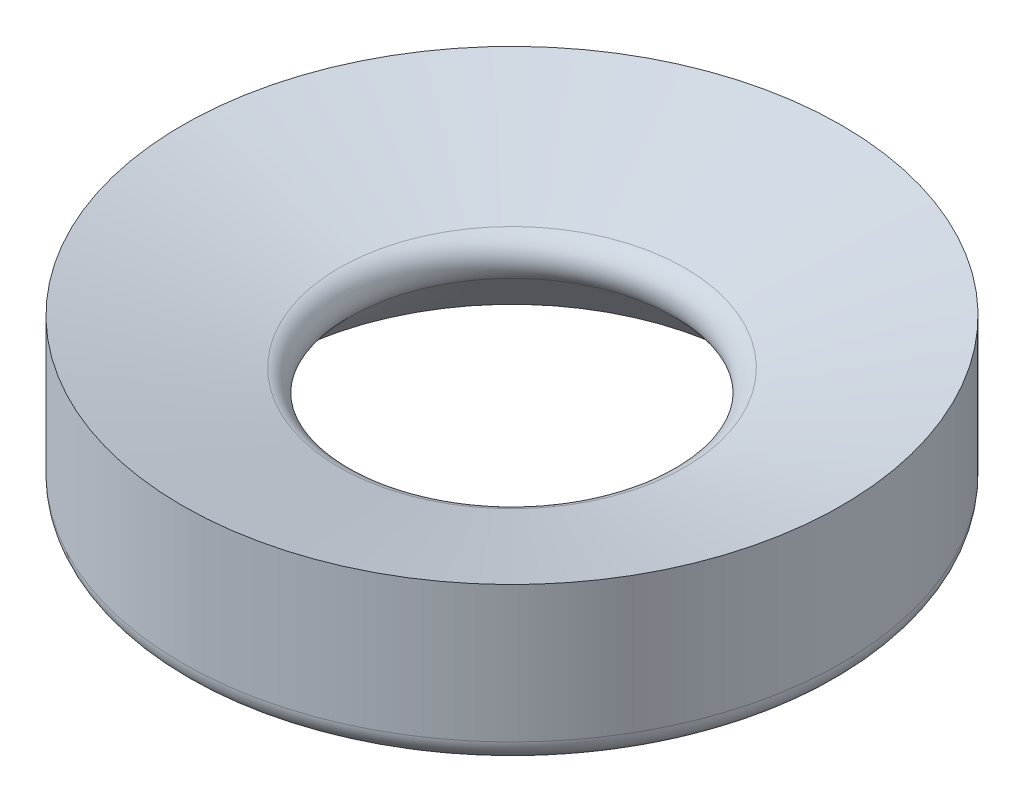
ISO-10303-21;
HEADER;
FILE_DESCRIPTION(('STEP AP214'),'2;1');
FILE_NAME('part.step','',(''),(''),'','','');
FILE_SCHEMA(('AUTOMOTIVE_DESIGN { 1 0 10303 214 1 1 1 1 }'));
ENDSEC;
DATA;
#1=APPLICATION_CONTEXT('core data for automotive mechanical design processes');
#2=APPLICATION_PROTOCOL_DEFINITION('international standard','automotive_design',2000,#1);
#3=PRODUCT_CONTEXT('',#1,'mechanical');
#4=PRODUCT('Part','Part','',(#3));
#5=PRODUCT_RELATED_PRODUCT_CATEGORY('part','',(#4));
#6=PRODUCT_DEFINITION_FORMATION('','',#4);
#7=PRODUCT_DEFINITION_CONTEXT('part definition',#1,'design');
#8=PRODUCT_DEFINITION('design','',#6,#7);
#9=PRODUCT_DEFINITION_SHAPE('','',#8);
#10=(LENGTH_UNIT() NAMED_UNIT(*) SI_UNIT(.MILLI.,.METRE.));
#11=(NAMED_UNIT(*) PLANE_ANGLE_UNIT() SI_UNIT($,.RADIAN.));
#12=(NAMED_UNIT(*) SI_UNIT($,.STERADIAN.) SOLID_ANGLE_UNIT());
#13=UNCERTAINTY_MEASURE_WITH_UNIT(LENGTH_MEASURE(1.E-05),#10,'distance_accuracy_value','');
#14=(GEOMETRIC_REPRESENTATION_CONTEXT(3) GLOBAL_UNCERTAINTY_ASSIGNED_CONTEXT((#13)) GLOBAL_UNIT_ASSIGNED_CONTEXT((#10,
#11,#12)) REPRESENTATION_CONTEXT('',''));
#15=CARTESIAN_POINT('',(0.,0.,0.));
#16=DIRECTION('',(0.,0.,1.));
#17=DIRECTION('',(1.,0.,0.));
#18=AXIS2_PLACEMENT_3D('',#15,#16,#17);
#19=CARTESIAN_POINT('',(0.,17.78,0.));
#20=DIRECTION('',(0.,-1.,0.));
#21=DIRECTION('',(0.,0.,-1.));
#22=AXIS2_PLACEMENT_3D('',#19,#20,#21);
#23=CYLINDRICAL_SURFACE('',#22,36.83);
#24=CARTESIAN_POINT('',(0.,2.54,0.));
#25=DIRECTION('',(0.,1.,0.));
#26=DIRECTION('',(0.,0.,1.));
#27=AXIS2_PLACEMENT_3D('',#24,#25,#26);
#28=CIRCLE('',#27,36.83);
#29=CARTESIAN_POINT('',(0.,2.54,-36.83));
#30=VERTEX_POINT('',#29);
#31=EDGE_CURVE('E50',#30,#30,#28,.T.);
#32=CARTESIAN_POINT('',(0.,17.78,0.));
#33=DIRECTION('',(0.,1.,0.));
#34=DIRECTION('',(0.,0.,1.));
#35=AXIS2_PLACEMENT_3D('',#32,#33,#34);
#36=CIRCLE('',#35,36.83);
#37=CARTESIAN_POINT('',(0.,17.78,-36.83));
#38=VERTEX_POINT('',#37);
#39=EDGE_CURVE('E57',#38,#38,#36,.T.);
#40=CARTESIAN_POINT('',(0.,2.54,-36.83));
#41=CARTESIAN_POINT('',(0.,2.69875,-36.83));
#42=CARTESIAN_POINT('',(0.,2.8575,-36.83));
#43=CARTESIAN_POINT('',(0.,3.175,-36.83));
#44=CARTESIAN_POINT('',(0.,3.33375,-36.83));
#45=CARTESIAN_POINT('',(0.,3.65125,-36.83));
#46=CARTESIAN_POINT('',(0.,3.81,-36.83));
#47=CARTESIAN_POINT('',(0.,4.1275,-36.83));
#48=CARTESIAN_POINT('',(0.,4.28625,-36.83));
#49=CARTESIAN_POINT('',(0.,4.60375,-36.83));
#50=CARTESIAN_POINT('',(0.,4.7625,-36.83));
#51=CARTESIAN_POINT('',(0.,5.08,-36.83));
#52=CARTESIAN_POINT('',(0.,5.23875,-36.83));
#53=CARTESIAN_POINT('',(0.,5.55625,-36.83));
#54=CARTESIAN_POINT('',(0.,5.715,-36.83));
#55=CARTESIAN_POINT('',(0.,6.0325,-36.83));
#56=CARTESIAN_POINT('',(0.,6.19125,-36.83));
#57=CARTESIAN_POINT('',(0.,6.50875,-36.83));
#58=CARTESIAN_POINT('',(0.,6.6675,-36.83));
#59=CARTESIAN_POINT('',(0.,6.985,-36.83));
#60=CARTESIAN_POINT('',(0.,7.14375,-36.83));
#61=CARTESIAN_POINT('',(0.,7.46125,-36.83));
#62=CARTESIAN_POINT('',(0.,7.62,-36.83));
#63=CARTESIAN_POINT('',(0.,7.9375,-36.83));
#64=CARTESIAN_POINT('',(0.,8.09625,-36.83));
#65=CARTESIAN_POINT('',(0.,8.41375,-36.83));
#66=CARTESIAN_POINT('',(0.,8.5725,-36.83));
#67=CARTESIAN_POINT('',(0.,8.89,-36.83));
#68=CARTESIAN_POINT('',(0.,9.04875,-36.83));
#69=CARTESIAN_POINT('',(0.,9.36625,-36.83));
#70=CARTESIAN_POINT('',(0.,9.525,-36.83));
#71=CARTESIAN_POINT('',(0.,9.8425,-36.83));
#72=CARTESIAN_POINT('',(0.,10.00125,-36.83));
#73=CARTESIAN_POINT('',(0.,10.31875,-36.83));
#74=CARTESIAN_POINT('',(0.,10.4775,-36.83));
#75=CARTESIAN_POINT('',(0.,10.795,-36.83));
#76=CARTESIAN_POINT('',(0.,10.95375,-36.83));
#77=CARTESIAN_POINT('',(0.,11.27125,-36.83));
#78=CARTESIAN_POINT('',(0.,11.43,-36.83));
#79=CARTESIAN_POINT('',(0.,11.7475,-36.83));
#80=CARTESIAN_POINT('',(0.,11.90625,-36.83));
#81=CARTESIAN_POINT('',(0.,12.22375,-36.83));
#82=CARTESIAN_POINT('',(0.,12.3825,-36.83));
#83=CARTESIAN_POINT('',(0.,12.7,-36.83));
#84=CARTESIAN_POINT('',(0.,12.85875,-36.83));
#85=CARTESIAN_POINT('',(0.,13.17625,-36.83));
#86=CARTESIAN_POINT('',(0.,13.335,-36.83));
#87=CARTESIAN_POINT('',(0.,13.6525,-36.83));
#88=CARTESIAN_POINT('',(0.,13.81125,-36.83));
#89=CARTESIAN_POINT('',(0.,14.12875,-36.83));
#90=CARTESIAN_POINT('',(0.,14.2875,-36.83));
#91=CARTESIAN_POINT('',(0.,14.605,-36.83));
#92=CARTESIAN_POINT('',(0.,14.76375,-36.83));
#93=CARTESIAN_POINT('',(0.,15.08125,-36.83));
#94=CARTESIAN_POINT('',(0.,15.24,-36.83));
#95=CARTESIAN_POINT('',(0.,15.5575,-36.83));
#96=CARTESIAN_POINT('',(0.,15.71625,-36.83));
#97=CARTESIAN_POINT('',(0.,16.03375,-36.83));
#98=CARTESIAN_POINT('',(0.,16.1925,-36.83));
#99=CARTESIAN_POINT('',(0.,16.51,-36.83));
#100=CARTESIAN_POINT('',(0.,16.66875,-36.83));
#101=CARTESIAN_POINT('',(0.,16.98625,-36.83));
#102=CARTESIAN_POINT('',(0.,17.145,-36.83));
#103=CARTESIAN_POINT('',(0.,17.4625,-36.83));
#104=CARTESIAN_POINT('',(0.,17.62125,-36.83));
#105=CARTESIAN_POINT('',(0.,17.78,-36.83));
#106=B_SPLINE_CURVE_WITH_KNOTS('',3,(#40,#41,#42,#43,#44,#45,#46,#47,#48,#49,#50,#51,#52,#53,
#54,#55,#56,#57,#58,#59,#60,#61,#62,#63,#64,#65,#66,#67,#68,#69,#70,#71,#72,#73,#74,#75,#76,#77,
#78,#79,#80,#81,#82,#83,#84,#85,#86,#87,#88,#89,#90,#91,#92,#93,#94,#95,#96,#97,#98,#99,#100,
#101,#102,#103,#104,#105),.UNSPECIFIED.,.F.,.F.,(4,2,2,2,2,2,2,2,2,2,2,2,2,2,2,2,2,2,2,2,2,2,2,
2,2,2,2,2,2,2,2,2,4),(0.,0.476249999999999,0.9525,1.42875,1.905,2.38125,2.8575,3.33375,3.81,
4.28625,4.7625,5.23875,5.715,6.19125,6.6675,7.14375,7.62,8.09625,8.5725,9.04875,9.525,10.00125,
10.4775,10.95375,11.43,11.90625,12.3825,12.85875,13.335,13.81125,14.2875,14.76375,15.24),.UNSPECIFIED.);
#107=EDGE_CURVE('BSEAM35',#30,#38,#106,.T.);
#108=ORIENTED_EDGE('',*,*,#31,.T.);
#109=ORIENTED_EDGE('',*,*,#39,.F.);
#110=ORIENTED_EDGE('',*,*,#107,.T.);
#111=ORIENTED_EDGE('',*,*,#107,.F.);
#112=EDGE_LOOP('',(#108,#110,#109,#111));
#113=FACE_BOUND('',#112,.T.);
#114=ADVANCED_FACE('F35',(#113),#23,.T.);
#115=CARTESIAN_POINT('',(0.,2.54,0.));
#116=DIRECTION('',(0.,1.,0.));
#117=DIRECTION('',(0.,0.,1.));
#118=AXIS2_PLACEMENT_3D('',#115,#116,#117);
#119=TOROIDAL_SURFACE('',#118,34.29,2.54);
#120=CARTESIAN_POINT('',(0.,0.,0.));
#121=DIRECTION('',(0.,1.,0.));
#122=DIRECTION('',(0.,0.,1.));
#123=AXIS2_PLACEMENT_3D('',#120,#121,#122);
#124=CIRCLE('',#123,34.29);
#125=CARTESIAN_POINT('',(0.,0.,34.29));
#126=VERTEX_POINT('',#125);
#127=EDGE_CURVE('E46',#126,#126,#124,.F.);
#128=ORIENTED_EDGE('',*,*,#127,.F.);
#129=EDGE_LOOP('',(#128));
#130=FACE_BOUND('',#129,.T.);
#131=ORIENTED_EDGE('',*,*,#31,.F.);
#132=EDGE_LOOP('',(#131));
#133=FACE_BOUND('',#132,.T.);
#134=ADVANCED_FACE('F101',(#130,#133),#119,.T.);
#135=CARTESIAN_POINT('',(0.,11.938,0.));
#136=DIRECTION('',(0.,-1.,0.));
#137=DIRECTION('',(0.,0.,-1.));
#138=AXIS2_PLACEMENT_3D('',#135,#136,#137);
#139=CONICAL_SURFACE('',#138,14.7955,0.782731503051742);
#140=CARTESIAN_POINT('',(0.,8.49988701262458,0.));
#141=DIRECTION('',(0.,1.,0.));
#142=DIRECTION('',(0.,0.,1.));
#143=AXIS2_PLACEMENT_3D('',#140,#141,#142);
#144=CIRCLE('',#143,18.2153251523362);
#145=CARTESIAN_POINT('',(0.,8.49988701262458,18.2153251523362));
#146=VERTEX_POINT('',#145);
#147=EDGE_CURVE('E42',#146,#146,#144,.T.);
#148=ORIENTED_EDGE('',*,*,#147,.T.);
#149=EDGE_LOOP('',(#148));
#150=FACE_BOUND('',#149,.T.);
#151=CARTESIAN_POINT('',(0.,0.,0.));
#152=DIRECTION('',(0.,1.,0.));
#153=DIRECTION('',(0.,0.,1.));
#154=AXIS2_PLACEMENT_3D('',#151,#152,#153);
#155=CIRCLE('',#154,26.67);
#156=CARTESIAN_POINT('',(0.,0.,26.67));
#157=VERTEX_POINT('',#156);
#158=EDGE_CURVE('E53',#157,#157,#155,.T.);
#159=ORIENTED_EDGE('',*,*,#158,.F.);
#160=EDGE_LOOP('',(#159));
#161=FACE_BOUND('',#160,.T.);
#162=ADVANCED_FACE('F73',(#150,#161),#139,.F.);
#163=CARTESIAN_POINT('',(0.,11.43,0.));
#164=DIRECTION('',(0.,1.,0.));
#165=DIRECTION('',(0.,0.,1.));
#166=AXIS2_PLACEMENT_3D('',#163,#164,#165);
#167=CONICAL_SURFACE('',#166,14.7955,1.29021443516034);
#168=CARTESIAN_POINT('',(0.,12.7318143431087,0.));
#169=DIRECTION('',(0.,-1.,0.));
#170=DIRECTION('',(0.,0.,-1.));
#171=AXIS2_PLACEMENT_3D('',#168,#169,#170);
#172=CIRCLE('',#171,19.3127957705873);
#173=CARTESIAN_POINT('',(0.,12.7318143431087,-19.3127957705873));
#174=VERTEX_POINT('',#173);
#175=EDGE_CURVE('E11',#174,#174,#172,.T.);
#176=ORIENTED_EDGE('',*,*,#175,.T.);
#177=EDGE_LOOP('',(#176));
#178=FACE_BOUND('',#177,.T.);
#179=ORIENTED_EDGE('',*,*,#39,.T.);
#180=EDGE_LOOP('',(#179));
#181=FACE_BOUND('',#180,.T.);
#182=ADVANCED_FACE('F89',(#178,#181),#167,.F.);
#183=CARTESIAN_POINT('',(0.,2.54,0.));
#184=DIRECTION('',(0.,-1.,0.));
#185=DIRECTION('',(0.,0.,-1.));
#186=AXIS2_PLACEMENT_3D('',#183,#184,#185);
#187=PLANE('',#186);
#188=CARTESIAN_POINT('',(0.,2.54,0.));
#189=DIRECTION('',(0.,-1.,0.));
#190=DIRECTION('',(0.,0.,-1.));
#191=AXIS2_PLACEMENT_3D('',#188,#189,#190);
#192=CIRCLE('',#191,29.21);
#193=CARTESIAN_POINT('',(0.,2.54,-29.21));
#194=VERTEX_POINT('',#193);
#195=EDGE_CURVE('E80',#194,#194,#192,.T.);
#196=ORIENTED_EDGE('',*,*,#195,.F.);
#197=EDGE_LOOP('',(#196));
#198=FACE_BOUND('',#197,.T.);
#199=CARTESIAN_POINT('',(0.,2.54,0.));
#200=DIRECTION('',(0.,-1.,0.));
#201=DIRECTION('',(0.,0.,-1.));
#202=AXIS2_PLACEMENT_3D('',#199,#200,#201);
#203=CIRCLE('',#202,31.75);
#204=CARTESIAN_POINT('',(0.,2.54,-31.75));
#205=VERTEX_POINT('',#204);
#206=EDGE_CURVE('E77',#205,#205,#203,.T.);
#207=ORIENTED_EDGE('',*,*,#206,.T.);
#208=EDGE_LOOP('',(#207));
#209=FACE_BOUND('',#208,.T.);
#210=ADVANCED_FACE('F85',(#198,#209),#187,.T.);
#211=CARTESIAN_POINT('',(0.,2.54,0.));
#212=DIRECTION('',(0.,1.,0.));
#213=DIRECTION('',(0.,0.,1.));
#214=AXIS2_PLACEMENT_3D('',#211,#212,#213);
#215=TOROIDAL_SURFACE('',#214,34.29,2.54);
#216=ORIENTED_EDGE('',*,*,#127,.T.);
#217=EDGE_LOOP('',(#216));
#218=FACE_BOUND('',#217,.T.);
#219=ORIENTED_EDGE('',*,*,#206,.F.);
#220=EDGE_LOOP('',(#219));
#221=FACE_BOUND('',#220,.T.);
#222=ADVANCED_FACE('F88',(#218,#221),#215,.T.);
#223=CARTESIAN_POINT('',(0.,2.54,0.));
#224=DIRECTION('',(0.,1.,0.));
#225=DIRECTION('',(0.,0.,1.));
#226=AXIS2_PLACEMENT_3D('',#223,#224,#225);
#227=TOROIDAL_SURFACE('',#226,26.67,2.54);
#228=ORIENTED_EDGE('',*,*,#195,.T.);
#229=EDGE_LOOP('',(#228));
#230=FACE_BOUND('',#229,.T.);
#231=ORIENTED_EDGE('',*,*,#158,.T.);
#232=EDGE_LOOP('',(#231));
#233=FACE_BOUND('',#232,.T.);
#234=ADVANCED_FACE('F71',(#230,#233),#227,.T.);
#235=CARTESIAN_POINT('',(0.,10.2911423980105,0.));
#236=DIRECTION('',(0.,-1.,0.));
#237=DIRECTION('',(0.,0.,-1.));
#238=AXIS2_PLACEMENT_3D('',#235,#236,#237);
#239=TOROIDAL_SURFACE('',#238,20.0161594435263,2.54);
#240=ORIENTED_EDGE('',*,*,#175,.F.);
#241=EDGE_LOOP('',(#240));
#242=FACE_BOUND('',#241,.T.);
#243=ORIENTED_EDGE('',*,*,#147,.F.);
#244=EDGE_LOOP('',(#243));
#245=FACE_BOUND('',#244,.T.);
#246=ADVANCED_FACE('F37',(#242,#245),#239,.T.);
#247=CLOSED_SHELL('',(#114,#134,#162,#182,#210,#222,#234,#246));
#248=MANIFOLD_SOLID_BREP('B2',#247);
#249=ADVANCED_BREP_SHAPE_REPRESENTATION('',(#18,#248),#14);
#250=SHAPE_DEFINITION_REPRESENTATION(#9,#249);
ENDSEC;
END-ISO-10303-21;
